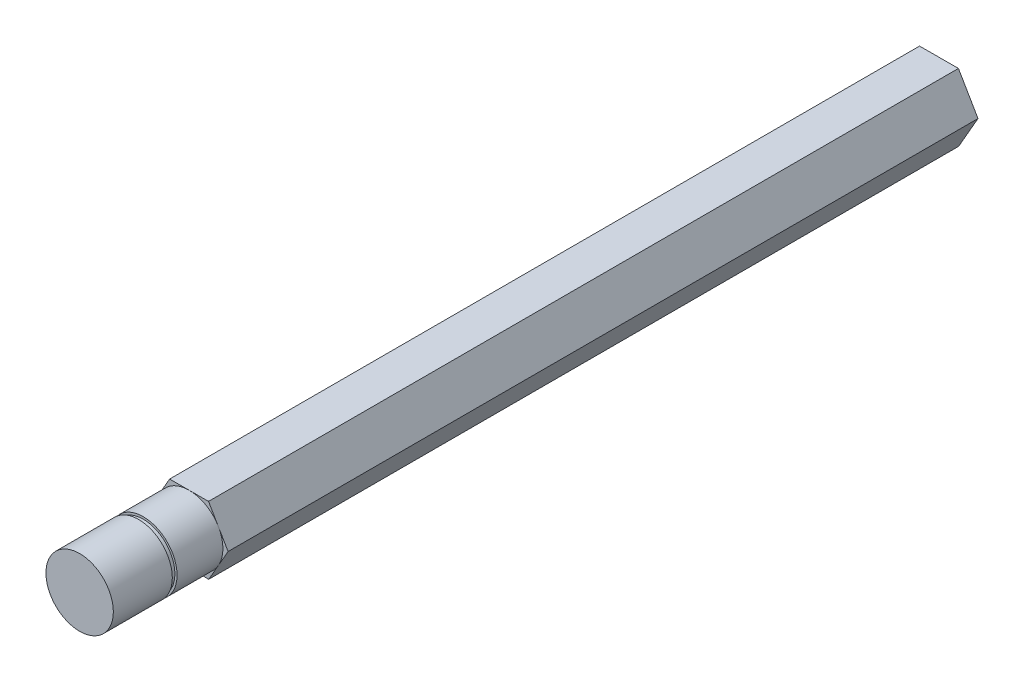
ISO-10303-21;
HEADER;
FILE_DESCRIPTION(('STEP AP214'),'2;1');
FILE_NAME('part.step','',(''),(''),'','','');
FILE_SCHEMA(('AUTOMOTIVE_DESIGN { 1 0 10303 214 1 1 1 1 }'));
ENDSEC;
DATA;
#1=APPLICATION_CONTEXT('core data for automotive mechanical design processes');
#2=APPLICATION_PROTOCOL_DEFINITION('international standard','automotive_design',2000,#1);
#3=PRODUCT_CONTEXT('',#1,'mechanical');
#4=PRODUCT('Part','Part','',(#3));
#5=PRODUCT_RELATED_PRODUCT_CATEGORY('part','',(#4));
#6=PRODUCT_DEFINITION_FORMATION('','',#4);
#7=PRODUCT_DEFINITION_CONTEXT('part definition',#1,'design');
#8=PRODUCT_DEFINITION('design','',#6,#7);
#9=PRODUCT_DEFINITION_SHAPE('','',#8);
#10=(LENGTH_UNIT() NAMED_UNIT(*) SI_UNIT(.MILLI.,.METRE.));
#11=(NAMED_UNIT(*) PLANE_ANGLE_UNIT() SI_UNIT($,.RADIAN.));
#12=(NAMED_UNIT(*) SI_UNIT($,.STERADIAN.) SOLID_ANGLE_UNIT());
#13=UNCERTAINTY_MEASURE_WITH_UNIT(LENGTH_MEASURE(1.E-05),#10,'distance_accuracy_value','');
#14=(GEOMETRIC_REPRESENTATION_CONTEXT(3) GLOBAL_UNCERTAINTY_ASSIGNED_CONTEXT((#13)) GLOBAL_UNIT_ASSIGNED_CONTEXT((#10,
#11,#12)) REPRESENTATION_CONTEXT('',''));
#15=CARTESIAN_POINT('',(0.,0.,0.));
#16=DIRECTION('',(0.,0.,1.));
#17=DIRECTION('',(1.,0.,0.));
#18=AXIS2_PLACEMENT_3D('',#15,#16,#17);
#19=CARTESIAN_POINT('',(0.,0.,65.0875));
#20=DIRECTION('',(0.,0.,1.));
#21=DIRECTION('',(1.,0.,0.));
#22=AXIS2_PLACEMENT_3D('',#19,#20,#21);
#23=CYLINDRICAL_SURFACE('',#22,6.35);
#24=CARTESIAN_POINT('',(0.,0.,65.0875));
#25=DIRECTION('',(0.,0.,1.));
#26=DIRECTION('',(1.,0.,0.));
#27=AXIS2_PLACEMENT_3D('',#24,#25,#26);
#28=CIRCLE('',#27,6.35);
#29=CARTESIAN_POINT('',(-5.49002273510836,-3.19094819262133,65.0875));
#30=VERTEX_POINT('',#29);
#31=CARTESIAN_POINT('',(0.0184308294159341,-6.34997325226863,65.0875));
#32=VERTEX_POINT('',#31);
#33=EDGE_CURVE('E213',#30,#32,#28,.T.);
#34=ORIENTED_EDGE('',*,*,#33,.T.);
#35=CARTESIAN_POINT('',(5.50845356452429,-3.1590250596473,65.0875));
#36=VERTEX_POINT('',#35);
#37=EDGE_CURVE('E127',#32,#36,#28,.T.);
#38=ORIENTED_EDGE('',*,*,#37,.T.);
#39=CARTESIAN_POINT('',(5.49002273510836,3.19094819262133,65.0875));
#40=VERTEX_POINT('',#39);
#41=EDGE_CURVE('E112',#36,#40,#28,.T.);
#42=ORIENTED_EDGE('',*,*,#41,.T.);
#43=CARTESIAN_POINT('',(-0.0184308294159326,6.34997325226863,65.0875));
#44=VERTEX_POINT('',#43);
#45=EDGE_CURVE('E124',#40,#44,#28,.T.);
#46=ORIENTED_EDGE('',*,*,#45,.T.);
#47=CARTESIAN_POINT('',(-5.50845356452429,3.1590250596473,65.0875));
#48=VERTEX_POINT('',#47);
#49=EDGE_CURVE('E136',#44,#48,#28,.T.);
#50=ORIENTED_EDGE('',*,*,#49,.T.);
#51=EDGE_CURVE('E49',#48,#30,#28,.T.);
#52=ORIENTED_EDGE('',*,*,#51,.T.);
#53=EDGE_LOOP('',(#34,#38,#42,#46,#50,#52));
#54=FACE_BOUND('',#53,.T.);
#55=CARTESIAN_POINT('',(0.,0.,73.7235));
#56=DIRECTION('',(0.,0.,1.));
#57=DIRECTION('',(1.,0.,0.));
#58=AXIS2_PLACEMENT_3D('',#55,#56,#57);
#59=CIRCLE('',#58,6.35);
#60=CARTESIAN_POINT('',(6.35,0.,73.7235));
#61=VERTEX_POINT('',#60);
#62=EDGE_CURVE('E36',#61,#61,#59,.F.);
#63=ORIENTED_EDGE('',*,*,#62,.T.);
#64=EDGE_LOOP('',(#63));
#65=FACE_BOUND('',#64,.T.);
#66=ADVANCED_FACE('F32',(#54,#65),#23,.T.);
#67=CARTESIAN_POINT('',(-3.64772793712828,-6.3606142965933,76.2));
#68=DIRECTION('',(-0.00290249282140695,0.999995787758839,0.));
#69=DIRECTION('',(-0.999995787758839,-0.00290249282140695,0.));
#70=AXIS2_PLACEMENT_3D('',#67,#68,#69);
#71=PLANE('',#70);
#72=DIRECTION('',(0.999995787758839,0.00290249282140695,0.));
#73=VECTOR('',#72,1.);
#74=CARTESIAN_POINT('',(-3.64772793712828,-6.3606142965933,65.0875));
#75=LINE('',#74,#73);
#76=CARTESIAN_POINT('',(-3.64772793712828,-6.36061429659331,65.0875));
#77=VERTEX_POINT('',#76);
#78=EDGE_CURVE('E149',#77,#32,#75,.T.);
#79=ORIENTED_EDGE('',*,*,#78,.F.);
#80=DIRECTION('',(0.,0.,-1.));
#81=VECTOR('',#80,1.);
#82=CARTESIAN_POINT('',(-3.64772793712828,-6.3606142965933,76.2));
#83=LINE('',#82,#81);
#84=CARTESIAN_POINT('',(-3.64772793712828,-6.3606142965933,-76.2));
#85=VERTEX_POINT('',#84);
#86=EDGE_CURVE('E57',#77,#85,#83,.T.);
#87=ORIENTED_EDGE('',*,*,#86,.T.);
#88=DIRECTION('',(0.999995787758839,0.00290249282140695,0.));
#89=VECTOR('',#88,1.);
#90=CARTESIAN_POINT('',(-3.64772793712828,-6.3606142965933,-76.2));
#91=LINE('',#90,#89);
#92=CARTESIAN_POINT('',(3.68458959596015,-6.33933220794395,-76.2));
#93=VERTEX_POINT('',#92);
#94=EDGE_CURVE('E150',#85,#93,#91,.T.);
#95=ORIENTED_EDGE('',*,*,#94,.T.);
#96=DIRECTION('',(0.,0.,-1.));
#97=VECTOR('',#96,1.);
#98=CARTESIAN_POINT('',(3.68458959596015,-6.33933220794395,76.2));
#99=LINE('',#98,#97);
#100=CARTESIAN_POINT('',(3.68458959596015,-6.33933220794395,65.0875));
#101=VERTEX_POINT('',#100);
#102=EDGE_CURVE('E173',#101,#93,#99,.T.);
#103=ORIENTED_EDGE('',*,*,#102,.F.);
#104=EDGE_CURVE('E147',#32,#101,#75,.T.);
#105=ORIENTED_EDGE('',*,*,#104,.F.);
#106=EDGE_LOOP('',(#79,#87,#95,#103,#105));
#107=FACE_BOUND('',#106,.T.);
#108=ADVANCED_FACE('F34',(#107),#71,.F.);
#109=CARTESIAN_POINT('',(3.68458959596015,-6.33933220794395,76.2));
#110=DIRECTION('',(-0.86747300228729,0.497484261361779,0.));
#111=DIRECTION('',(-0.49748426136178,-0.86747300228729,0.));
#112=AXIS2_PLACEMENT_3D('',#109,#110,#111);
#113=PLANE('',#112);
#114=DIRECTION('',(0.49748426136178,0.86747300228729,0.));
#115=VECTOR('',#114,1.);
#116=CARTESIAN_POINT('',(3.68458959596015,-6.33933220794395,65.0875));
#117=LINE('',#116,#115);
#118=EDGE_CURVE('E146',#101,#36,#117,.T.);
#119=ORIENTED_EDGE('',*,*,#118,.F.);
#120=ORIENTED_EDGE('',*,*,#102,.T.);
#121=DIRECTION('',(0.497484261361779,0.86747300228729,0.));
#122=VECTOR('',#121,1.);
#123=CARTESIAN_POINT('',(3.68458959596015,-6.33933220794395,-76.2));
#124=LINE('',#123,#122);
#125=CARTESIAN_POINT('',(7.33231753308843,0.0212820886493565,-76.2));
#126=VERTEX_POINT('',#125);
#127=EDGE_CURVE('E152',#93,#126,#124,.T.);
#128=ORIENTED_EDGE('',*,*,#127,.T.);
#129=DIRECTION('',(0.,0.,-1.));
#130=VECTOR('',#129,1.);
#131=CARTESIAN_POINT('',(7.33231753308843,0.0212820886493565,76.2));
#132=LINE('',#131,#130);
#133=CARTESIAN_POINT('',(7.33231753308843,0.0212820886493544,65.0875));
#134=VERTEX_POINT('',#133);
#135=EDGE_CURVE('E171',#134,#126,#132,.T.);
#136=ORIENTED_EDGE('',*,*,#135,.F.);
#137=EDGE_CURVE('E115',#36,#134,#117,.T.);
#138=ORIENTED_EDGE('',*,*,#137,.F.);
#139=EDGE_LOOP('',(#119,#120,#128,#136,#138));
#140=FACE_BOUND('',#139,.T.);
#141=ADVANCED_FACE('F221',(#140),#113,.F.);
#142=CARTESIAN_POINT('',(7.33231753308843,0.0212820886493565,76.2));
#143=DIRECTION('',(-0.864570509465883,-0.50251152639706,0.));
#144=DIRECTION('',(0.50251152639706,-0.864570509465883,0.));
#145=AXIS2_PLACEMENT_3D('',#142,#143,#144);
#146=PLANE('',#145);
#147=DIRECTION('',(-0.50251152639706,0.864570509465883,0.));
#148=VECTOR('',#147,1.);
#149=CARTESIAN_POINT('',(7.33231753308843,0.0212820886493565,65.0875));
#150=LINE('',#149,#148);
#151=EDGE_CURVE('E109',#134,#40,#150,.T.);
#152=ORIENTED_EDGE('',*,*,#151,.F.);
#153=ORIENTED_EDGE('',*,*,#135,.T.);
#154=DIRECTION('',(-0.50251152639706,0.864570509465883,0.));
#155=VECTOR('',#154,1.);
#156=CARTESIAN_POINT('',(7.33231753308843,0.0212820886493565,-76.2));
#157=LINE('',#156,#155);
#158=CARTESIAN_POINT('',(3.64772793712828,6.36061429659331,-76.2));
#159=VERTEX_POINT('',#158);
#160=EDGE_CURVE('E155',#126,#159,#157,.T.);
#161=ORIENTED_EDGE('',*,*,#160,.T.);
#162=DIRECTION('',(0.,0.,-1.));
#163=VECTOR('',#162,1.);
#164=CARTESIAN_POINT('',(3.64772793712828,6.36061429659331,76.2));
#165=LINE('',#164,#163);
#166=CARTESIAN_POINT('',(3.64772793712828,6.36061429659331,65.0875));
#167=VERTEX_POINT('',#166);
#168=EDGE_CURVE('E140',#167,#159,#165,.T.);
#169=ORIENTED_EDGE('',*,*,#168,.F.);
#170=EDGE_CURVE('E119',#40,#167,#150,.T.);
#171=ORIENTED_EDGE('',*,*,#170,.F.);
#172=EDGE_LOOP('',(#152,#153,#161,#169,#171));
#173=FACE_BOUND('',#172,.T.);
#174=ADVANCED_FACE('F138',(#173),#146,.F.);
#175=CARTESIAN_POINT('',(3.64772793712828,6.36061429659331,76.2));
#176=DIRECTION('',(0.00290249282140672,-0.999995787758839,0.));
#177=DIRECTION('',(0.999995787758839,0.00290249282140672,0.));
#178=AXIS2_PLACEMENT_3D('',#175,#176,#177);
#179=PLANE('',#178);
#180=DIRECTION('',(-0.999995787758839,-0.00290249282140672,0.));
#181=VECTOR('',#180,1.);
#182=CARTESIAN_POINT('',(3.64772793712828,6.36061429659331,65.0875));
#183=LINE('',#182,#181);
#184=EDGE_CURVE('E133',#167,#44,#183,.T.);
#185=ORIENTED_EDGE('',*,*,#184,.F.);
#186=ORIENTED_EDGE('',*,*,#168,.T.);
#187=DIRECTION('',(-0.999995787758839,-0.00290249282140672,0.));
#188=VECTOR('',#187,1.);
#189=CARTESIAN_POINT('',(3.64772793712828,6.36061429659331,-76.2));
#190=LINE('',#189,#188);
#191=CARTESIAN_POINT('',(-3.68458959596015,6.33933220794395,-76.2));
#192=VERTEX_POINT('',#191);
#193=EDGE_CURVE('E157',#159,#192,#190,.T.);
#194=ORIENTED_EDGE('',*,*,#193,.T.);
#195=DIRECTION('',(0.,0.,-1.));
#196=VECTOR('',#195,1.);
#197=CARTESIAN_POINT('',(-3.68458959596015,6.33933220794395,76.2));
#198=LINE('',#197,#196);
#199=CARTESIAN_POINT('',(-3.68458959596014,6.33933220794396,65.0875));
#200=VERTEX_POINT('',#199);
#201=EDGE_CURVE('E168',#200,#192,#198,.T.);
#202=ORIENTED_EDGE('',*,*,#201,.F.);
#203=EDGE_CURVE('E141',#44,#200,#183,.T.);
#204=ORIENTED_EDGE('',*,*,#203,.F.);
#205=EDGE_LOOP('',(#185,#186,#194,#202,#204));
#206=FACE_BOUND('',#205,.T.);
#207=ADVANCED_FACE('F201',(#206),#179,.F.);
#208=CARTESIAN_POINT('',(-3.68458959596015,6.33933220794395,76.2));
#209=DIRECTION('',(0.86747300228729,-0.49748426136178,0.));
#210=DIRECTION('',(0.49748426136178,0.86747300228729,0.));
#211=AXIS2_PLACEMENT_3D('',#208,#209,#210);
#212=PLANE('',#211);
#213=DIRECTION('',(-0.49748426136178,-0.86747300228729,0.));
#214=VECTOR('',#213,1.);
#215=CARTESIAN_POINT('',(-3.68458959596015,6.33933220794395,65.0875));
#216=LINE('',#215,#214);
#217=EDGE_CURVE('E189',#200,#48,#216,.T.);
#218=ORIENTED_EDGE('',*,*,#217,.F.);
#219=ORIENTED_EDGE('',*,*,#201,.T.);
#220=DIRECTION('',(-0.49748426136178,-0.86747300228729,0.));
#221=VECTOR('',#220,1.);
#222=CARTESIAN_POINT('',(-3.68458959596015,6.33933220794395,-76.2));
#223=LINE('',#222,#221);
#224=CARTESIAN_POINT('',(-7.33231753308843,-0.0212820886493516,-76.2));
#225=VERTEX_POINT('',#224);
#226=EDGE_CURVE('E160',#192,#225,#223,.T.);
#227=ORIENTED_EDGE('',*,*,#226,.T.);
#228=DIRECTION('',(0.,0.,-1.));
#229=VECTOR('',#228,1.);
#230=CARTESIAN_POINT('',(-7.33231753308843,-0.0212820886493516,76.2));
#231=LINE('',#230,#229);
#232=CARTESIAN_POINT('',(-7.33231753308844,-0.021282088649351,65.0875));
#233=VERTEX_POINT('',#232);
#234=EDGE_CURVE('E166',#233,#225,#231,.T.);
#235=ORIENTED_EDGE('',*,*,#234,.F.);
#236=EDGE_CURVE('E135',#48,#233,#216,.T.);
#237=ORIENTED_EDGE('',*,*,#236,.F.);
#238=EDGE_LOOP('',(#218,#219,#227,#235,#237));
#239=FACE_BOUND('',#238,.T.);
#240=ADVANCED_FACE('F199',(#239),#212,.F.);
#241=CARTESIAN_POINT('',(-7.33231753308843,-0.0212820886493516,76.2));
#242=DIRECTION('',(0.864570509465883,0.50251152639706,0.));
#243=DIRECTION('',(-0.50251152639706,0.864570509465883,0.));
#244=AXIS2_PLACEMENT_3D('',#241,#242,#243);
#245=PLANE('',#244);
#246=DIRECTION('',(0.50251152639706,-0.864570509465883,0.));
#247=VECTOR('',#246,1.);
#248=CARTESIAN_POINT('',(-7.33231753308843,-0.0212820886493516,65.0875));
#249=LINE('',#248,#247);
#250=EDGE_CURVE('E11',#233,#30,#249,.T.);
#251=ORIENTED_EDGE('',*,*,#250,.F.);
#252=ORIENTED_EDGE('',*,*,#234,.T.);
#253=DIRECTION('',(0.50251152639706,-0.864570509465883,0.));
#254=VECTOR('',#253,1.);
#255=CARTESIAN_POINT('',(-7.33231753308843,-0.0212820886493516,-76.2));
#256=LINE('',#255,#254);
#257=EDGE_CURVE('E163',#225,#85,#256,.T.);
#258=ORIENTED_EDGE('',*,*,#257,.T.);
#259=ORIENTED_EDGE('',*,*,#86,.F.);
#260=EDGE_CURVE('E41',#30,#77,#249,.T.);
#261=ORIENTED_EDGE('',*,*,#260,.F.);
#262=EDGE_LOOP('',(#251,#252,#258,#259,#261));
#263=FACE_BOUND('',#262,.T.);
#264=ADVANCED_FACE('F210',(#263),#245,.F.);
#265=CARTESIAN_POINT('',(0.,0.,-76.2));
#266=DIRECTION('',(0.,0.,1.));
#267=DIRECTION('',(1.,0.,0.));
#268=AXIS2_PLACEMENT_3D('',#265,#266,#267);
#269=PLANE('',#268);
#270=ORIENTED_EDGE('',*,*,#94,.F.);
#271=ORIENTED_EDGE('',*,*,#257,.F.);
#272=ORIENTED_EDGE('',*,*,#226,.F.);
#273=ORIENTED_EDGE('',*,*,#193,.F.);
#274=ORIENTED_EDGE('',*,*,#160,.F.);
#275=ORIENTED_EDGE('',*,*,#127,.F.);
#276=EDGE_LOOP('',(#270,#271,#272,#273,#274,#275));
#277=FACE_BOUND('',#276,.T.);
#278=ADVANCED_FACE('F208',(#277),#269,.F.);
#279=CARTESIAN_POINT('',(0.,0.,65.0875));
#280=DIRECTION('',(0.,0.,1.));
#281=DIRECTION('',(1.,0.,0.));
#282=AXIS2_PLACEMENT_3D('',#279,#280,#281);
#283=PLANE('',#282);
#284=ORIENTED_EDGE('',*,*,#78,.T.);
#285=ORIENTED_EDGE('',*,*,#33,.F.);
#286=ORIENTED_EDGE('',*,*,#260,.T.);
#287=EDGE_LOOP('',(#284,#285,#286));
#288=FACE_BOUND('',#287,.T.);
#289=ADVANCED_FACE('F260',(#288),#283,.T.);
#290=ORIENTED_EDGE('',*,*,#104,.T.);
#291=ORIENTED_EDGE('',*,*,#118,.T.);
#292=ORIENTED_EDGE('',*,*,#37,.F.);
#293=EDGE_LOOP('',(#290,#291,#292));
#294=FACE_BOUND('',#293,.T.);
#295=ADVANCED_FACE('F219',(#294),#283,.T.);
#296=ORIENTED_EDGE('',*,*,#137,.T.);
#297=ORIENTED_EDGE('',*,*,#151,.T.);
#298=ORIENTED_EDGE('',*,*,#41,.F.);
#299=EDGE_LOOP('',(#296,#297,#298));
#300=FACE_BOUND('',#299,.T.);
#301=ADVANCED_FACE('F111',(#300),#283,.T.);
#302=ORIENTED_EDGE('',*,*,#170,.T.);
#303=ORIENTED_EDGE('',*,*,#184,.T.);
#304=ORIENTED_EDGE('',*,*,#45,.F.);
#305=EDGE_LOOP('',(#302,#303,#304));
#306=FACE_BOUND('',#305,.T.);
#307=ADVANCED_FACE('F131',(#306),#283,.T.);
#308=ORIENTED_EDGE('',*,*,#203,.T.);
#309=ORIENTED_EDGE('',*,*,#217,.T.);
#310=ORIENTED_EDGE('',*,*,#49,.F.);
#311=EDGE_LOOP('',(#308,#309,#310));
#312=FACE_BOUND('',#311,.T.);
#313=ADVANCED_FACE('F195',(#312),#283,.T.);
#314=ORIENTED_EDGE('',*,*,#236,.T.);
#315=ORIENTED_EDGE('',*,*,#250,.T.);
#316=ORIENTED_EDGE('',*,*,#51,.F.);
#317=EDGE_LOOP('',(#314,#315,#316));
#318=FACE_BOUND('',#317,.T.);
#319=ADVANCED_FACE('F212',(#318),#283,.T.);
#320=CARTESIAN_POINT('',(0.,0.,73.7235));
#321=DIRECTION('',(0.,0.,1.));
#322=DIRECTION('',(1.,0.,0.));
#323=AXIS2_PLACEMENT_3D('',#320,#321,#322);
#324=PLANE('',#323);
#325=ORIENTED_EDGE('',*,*,#62,.F.);
#326=EDGE_LOOP('',(#325));
#327=FACE_BOUND('',#326,.T.);
#328=CARTESIAN_POINT('',(0.,0.,73.7235));
#329=DIRECTION('',(0.,0.,1.));
#330=DIRECTION('',(1.,0.,0.));
#331=AXIS2_PLACEMENT_3D('',#328,#329,#330);
#332=CIRCLE('',#331,5.9436);
#333=CARTESIAN_POINT('',(5.9436,0.,73.7235));
#334=VERTEX_POINT('',#333);
#335=EDGE_CURVE('E176',#334,#334,#332,.T.);
#336=ORIENTED_EDGE('',*,*,#335,.F.);
#337=EDGE_LOOP('',(#336));
#338=FACE_BOUND('',#337,.T.);
#339=ADVANCED_FACE('F254',(#327,#338),#324,.T.);
#340=CARTESIAN_POINT('',(0.,0.,74.6125));
#341=DIRECTION('',(0.,0.,1.));
#342=DIRECTION('',(1.,0.,0.));
#343=AXIS2_PLACEMENT_3D('',#340,#341,#342);
#344=PLANE('',#343);
#345=CARTESIAN_POINT('',(0.,0.,74.6125));
#346=DIRECTION('',(0.,0.,1.));
#347=DIRECTION('',(1.,0.,0.));
#348=AXIS2_PLACEMENT_3D('',#345,#346,#347);
#349=CIRCLE('',#348,6.35);
#350=CARTESIAN_POINT('',(6.35,0.,74.6125));
#351=VERTEX_POINT('',#350);
#352=EDGE_CURVE('E174',#351,#351,#349,.F.);
#353=ORIENTED_EDGE('',*,*,#352,.T.);
#354=EDGE_LOOP('',(#353));
#355=FACE_BOUND('',#354,.T.);
#356=CARTESIAN_POINT('',(0.,0.,74.6125));
#357=DIRECTION('',(0.,0.,1.));
#358=DIRECTION('',(1.,0.,0.));
#359=AXIS2_PLACEMENT_3D('',#356,#357,#358);
#360=CIRCLE('',#359,5.9436);
#361=CARTESIAN_POINT('',(5.9436,0.,74.6125));
#362=VERTEX_POINT('',#361);
#363=EDGE_CURVE('E181',#362,#362,#360,.T.);
#364=ORIENTED_EDGE('',*,*,#363,.T.);
#365=EDGE_LOOP('',(#364));
#366=FACE_BOUND('',#365,.T.);
#367=ADVANCED_FACE('F249',(#355,#366),#344,.F.);
#368=CARTESIAN_POINT('',(0.,0.,73.7235));
#369=DIRECTION('',(0.,0.,1.));
#370=DIRECTION('',(1.,0.,0.));
#371=AXIS2_PLACEMENT_3D('',#368,#369,#370);
#372=CYLINDRICAL_SURFACE('',#371,5.9436);
#373=ORIENTED_EDGE('',*,*,#335,.T.);
#374=EDGE_LOOP('',(#373));
#375=FACE_BOUND('',#374,.T.);
#376=ORIENTED_EDGE('',*,*,#363,.F.);
#377=EDGE_LOOP('',(#376));
#378=FACE_BOUND('',#377,.T.);
#379=ADVANCED_FACE('F242',(#375,#378),#372,.T.);
#380=CARTESIAN_POINT('',(0.,0.,85.725));
#381=DIRECTION('',(0.,0.,1.));
#382=DIRECTION('',(1.,0.,0.));
#383=AXIS2_PLACEMENT_3D('',#380,#381,#382);
#384=PLANE('',#383);
#385=CARTESIAN_POINT('',(0.,0.,85.725));
#386=DIRECTION('',(0.,0.,1.));
#387=DIRECTION('',(1.,0.,0.));
#388=AXIS2_PLACEMENT_3D('',#385,#386,#387);
#389=CIRCLE('',#388,6.35);
#390=CARTESIAN_POINT('',(6.35,0.,85.725));
#391=VERTEX_POINT('',#390);
#392=EDGE_CURVE('E128',#391,#391,#389,.T.);
#393=ORIENTED_EDGE('',*,*,#392,.T.);
#394=EDGE_LOOP('',(#393));
#395=FACE_BOUND('',#394,.T.);
#396=ADVANCED_FACE('F237',(#395),#384,.T.);
#397=ORIENTED_EDGE('',*,*,#352,.F.);
#398=EDGE_LOOP('',(#397));
#399=FACE_BOUND('',#398,.T.);
#400=ORIENTED_EDGE('',*,*,#392,.F.);
#401=EDGE_LOOP('',(#400));
#402=FACE_BOUND('',#401,.T.);
#403=ADVANCED_FACE('F231',(#399,#402),#23,.T.);
#404=CLOSED_SHELL('',(#66,#108,#141,#174,#207,#240,#264,#278,#289,#295,#301,#307,#313,#319,#339,
#367,#379,#396,#403));
#405=MANIFOLD_SOLID_BREP('B2',#404);
#406=ADVANCED_BREP_SHAPE_REPRESENTATION('',(#18,#405),#14);
#407=SHAPE_DEFINITION_REPRESENTATION(#9,#406);
ENDSEC;
END-ISO-10303-21;
